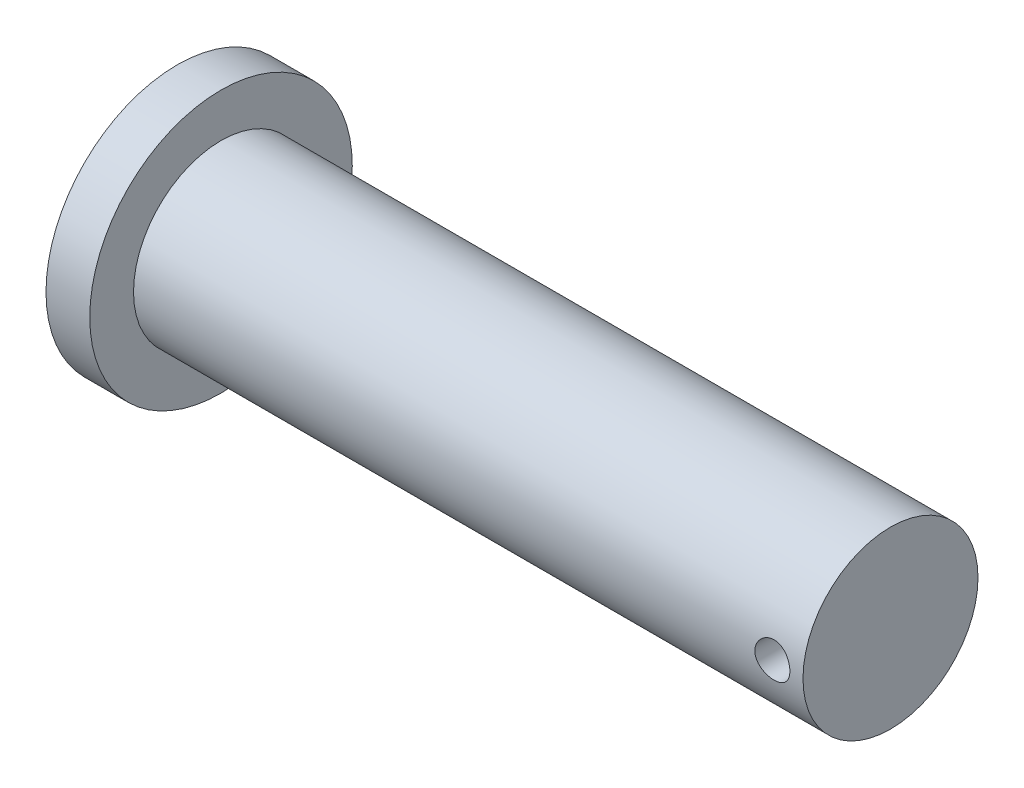
ISO-10303-21;
HEADER;
FILE_DESCRIPTION(('STEP AP214'),'2;1');
FILE_NAME('part.step','',(''),(''),'','','');
FILE_SCHEMA(('AUTOMOTIVE_DESIGN { 1 0 10303 214 1 1 1 1 }'));
ENDSEC;
DATA;
#1=APPLICATION_CONTEXT('core data for automotive mechanical design processes');
#2=APPLICATION_PROTOCOL_DEFINITION('international standard','automotive_design',2000,#1);
#3=PRODUCT_CONTEXT('',#1,'mechanical');
#4=PRODUCT('Part','Part','',(#3));
#5=PRODUCT_RELATED_PRODUCT_CATEGORY('part','',(#4));
#6=PRODUCT_DEFINITION_FORMATION('','',#4);
#7=PRODUCT_DEFINITION_CONTEXT('part definition',#1,'design');
#8=PRODUCT_DEFINITION('design','',#6,#7);
#9=PRODUCT_DEFINITION_SHAPE('','',#8);
#10=(LENGTH_UNIT() NAMED_UNIT(*) SI_UNIT(.MILLI.,.METRE.));
#11=(NAMED_UNIT(*) PLANE_ANGLE_UNIT() SI_UNIT($,.RADIAN.));
#12=(NAMED_UNIT(*) SI_UNIT($,.STERADIAN.) SOLID_ANGLE_UNIT());
#13=UNCERTAINTY_MEASURE_WITH_UNIT(LENGTH_MEASURE(1.E-05),#10,'distance_accuracy_value','');
#14=(GEOMETRIC_REPRESENTATION_CONTEXT(3) GLOBAL_UNCERTAINTY_ASSIGNED_CONTEXT((#13)) GLOBAL_UNIT_ASSIGNED_CONTEXT((#10,
#11,#12)) REPRESENTATION_CONTEXT('',''));
#15=CARTESIAN_POINT('',(0.,0.,0.));
#16=DIRECTION('',(0.,0.,1.));
#17=DIRECTION('',(1.,0.,0.));
#18=AXIS2_PLACEMENT_3D('',#15,#16,#17);
#19=CARTESIAN_POINT('',(40.75,0.,0.));
#20=DIRECTION('',(-1.,0.,0.));
#21=DIRECTION('',(0.,0.,1.));
#22=AXIS2_PLACEMENT_3D('',#19,#20,#21);
#23=CYLINDRICAL_SURFACE('',#22,4.99999999999989);
#24=CARTESIAN_POINT('',(40.,0.,4.99999999999989));
#25=CARTESIAN_POINT('',(39.9999979555017,0.0555769067926329,4.9999989758086));
#26=CARTESIAN_POINT('',(39.9953511570324,0.111179660201522,4.9990638517822));
#27=CARTESIAN_POINT('',(39.9769014998848,0.220813507689018,4.99542365623221));
#28=CARTESIAN_POINT('',(39.9630913671985,0.274843317541355,4.99271717860175));
#29=CARTESIAN_POINT('',(39.9267587263792,0.379730305263312,4.98583649278276));
#30=CARTESIAN_POINT('',(39.9042445631553,0.430590467933134,4.98166369076707));
#31=CARTESIAN_POINT('',(39.8511677524887,0.527807988864225,4.97230398035304));
#32=CARTESIAN_POINT('',(39.8206055843928,0.57416561507581,4.96711713235696));
#33=CARTESIAN_POINT('',(39.7518615057086,0.661693477314862,4.95622165329959));
#34=CARTESIAN_POINT('',(39.7135916446088,0.702793951158522,4.95050745504337));
#35=CARTESIAN_POINT('',(39.6307075836083,0.778036756608025,4.93924180452578));
#36=CARTESIAN_POINT('',(39.5860928886649,0.812178544770421,4.93369036500413));
#37=CARTESIAN_POINT('',(39.4912838069881,0.872831753347618,4.92332441812604));
#38=CARTESIAN_POINT('',(39.4410423562036,0.899270938865865,4.91851707364935));
#39=CARTESIAN_POINT('',(39.3367181809959,0.943305666580306,4.91026268058407));
#40=CARTESIAN_POINT('',(39.2826358366537,0.960902082437236,4.90681549761951));
#41=CARTESIAN_POINT('',(39.1729156360921,0.986525299884825,4.90172805252194));
#42=CARTESIAN_POINT('',(39.1173074558578,0.994674497958775,4.90006470107177));
#43=CARTESIAN_POINT('',(39.0054901786357,1.00155212772612,4.89866375060616));
#44=CARTESIAN_POINT('',(38.9492811436799,1.0002815227135,4.8989259546783));
#45=CARTESIAN_POINT('',(38.838753211979,0.988454573101817,4.90132551148174));
#46=CARTESIAN_POINT('',(38.7844185943727,0.978038540243904,4.90343452858753));
#47=CARTESIAN_POINT('',(38.678283923337,0.94843788462305,4.9092454615999));
#48=CARTESIAN_POINT('',(38.626483991081,0.929252843100679,4.91294745357768));
#49=CARTESIAN_POINT('',(38.5264847382964,0.882524783674718,4.92155618500397));
#50=CARTESIAN_POINT('',(38.4783121204308,0.854926151232114,4.92647089813694));
#51=CARTESIAN_POINT('',(38.3872291500272,0.792193574572679,4.93694618773051));
#52=CARTESIAN_POINT('',(38.3443194031489,0.757058764356829,4.94250683838355));
#53=CARTESIAN_POINT('',(38.2641705975431,0.679499934560585,4.95377021241451));
#54=CARTESIAN_POINT('',(38.2270474321409,0.636956161212446,4.95947369210894));
#55=CARTESIAN_POINT('',(38.1604461536988,0.546185024062011,4.97028848714398));
#56=CARTESIAN_POINT('',(38.1309681387064,0.49795758737939,4.97539979488963));
#57=CARTESIAN_POINT('',(38.080472490774,0.397059386878921,4.98446690160876));
#58=CARTESIAN_POINT('',(38.0594681063555,0.344381819585301,4.98842088848261));
#59=CARTESIAN_POINT('',(38.0266395259614,0.236148976448668,4.99471408987848));
#60=CARTESIAN_POINT('',(38.0148142179264,0.180594050072455,4.99705350000521));
#61=CARTESIAN_POINT('',(38.0008435462057,0.0691794056271562,4.99982671866857));
#62=CARTESIAN_POINT('',(37.9985395804597,0.0133403283255813,5.00029174652459));
#63=CARTESIAN_POINT('',(38.0032498589422,-0.0979249341927102,4.99935051930092));
#64=CARTESIAN_POINT('',(38.0102635793526,-0.15335114244379,4.99794436941435));
#65=CARTESIAN_POINT('',(38.033278373544,-0.261705659946539,4.99343832008007));
#66=CARTESIAN_POINT('',(38.0491980684979,-0.314651948339902,4.99035376404196));
#67=CARTESIAN_POINT('',(38.0894839826558,-0.417123627499666,4.98283552061022));
#68=CARTESIAN_POINT('',(38.1138508346768,-0.466648761637537,4.97840173214216));
#69=CARTESIAN_POINT('',(38.1706824906513,-0.561541173686214,4.96859911533284));
#70=CARTESIAN_POINT('',(38.2032427810389,-0.606850126752183,4.96321950437041));
#71=CARTESIAN_POINT('',(38.2754091912073,-0.691418019119202,4.95214734829872));
#72=CARTESIAN_POINT('',(38.3150160663999,-0.730676308930758,4.94645476968377));
#73=CARTESIAN_POINT('',(38.4008733518911,-0.802640590774173,4.93529303556954));
#74=CARTESIAN_POINT('',(38.4472157442213,-0.835237702448653,4.92982860233293));
#75=CARTESIAN_POINT('',(38.5448113613567,-0.892185420051203,4.91984191796183));
#76=CARTESIAN_POINT('',(38.5960643895736,-0.9165363559229,4.91531962913332));
#77=CARTESIAN_POINT('',(38.7017682461495,-0.956151841581958,4.90776740584372));
#78=CARTESIAN_POINT('',(38.7562008412103,-0.971463499791049,4.90472974872176));
#79=CARTESIAN_POINT('',(38.8669334534909,-0.992708651627194,4.90047436792014));
#80=CARTESIAN_POINT('',(38.9232332262093,-0.99864336822511,4.89925640691101));
#81=CARTESIAN_POINT('',(39.0350088645443,-1.00092091086747,4.89879149631368));
#82=CARTESIAN_POINT('',(39.090481148927,-0.997435788070895,4.8995091918929));
#83=CARTESIAN_POINT('',(39.200031649905,-0.981352304100061,4.90275573484603));
#84=CARTESIAN_POINT('',(39.2541098776948,-0.968754016129298,4.90528456767158));
#85=CARTESIAN_POINT('',(39.3592277112405,-0.934878568498954,4.91185264219148));
#86=CARTESIAN_POINT('',(39.4102743605024,-0.913622506717344,4.9158882101882));
#87=CARTESIAN_POINT('',(39.5081037207344,-0.863054644601604,4.92501714974159));
#88=CARTESIAN_POINT('',(39.5548860737251,-0.833742168774882,4.93011060998883));
#89=CARTESIAN_POINT('',(39.6437155721503,-0.767305914786414,4.94088960523215));
#90=CARTESIAN_POINT('',(39.6856687652676,-0.730057887235182,4.94658372909689));
#91=CARTESIAN_POINT('',(39.7627862055292,-0.649064369013142,4.95786081871944));
#92=CARTESIAN_POINT('',(39.7979488903173,-0.605317387153335,4.96344375863174));
#93=CARTESIAN_POINT('',(39.8608346439464,-0.512017629088247,4.97393832387961));
#94=CARTESIAN_POINT('',(39.88847600328,-0.462408884429835,4.97884231219235));
#95=CARTESIAN_POINT('',(39.9349861225966,-0.359166360940734,4.98735125084989));
#96=CARTESIAN_POINT('',(39.9538627895325,-0.305536260863127,4.99095737138605));
#97=CARTESIAN_POINT('',(39.9786519480447,-0.209821488923781,4.9957637259536));
#98=CARTESIAN_POINT('',(39.9866431937078,-0.168281664013786,4.99734303158441));
#99=CARTESIAN_POINT('',(39.9973179123584,-0.0844995252100677,4.99946154139882));
#100=CARTESIAN_POINT('',(40.0000015545098,-0.0422572337486193,5.00000077873144));
#101=CARTESIAN_POINT('',(40.,0.,4.99999999999989));
#102=B_SPLINE_CURVE_WITH_KNOTS('',3,(#24,#25,#26,#27,#28,#29,#30,#31,#32,#33,#34,#35,#36,#37,
#38,#39,#40,#41,#42,#43,#44,#45,#46,#47,#48,#49,#50,#51,#52,#53,#54,#55,#56,#57,#58,#59,#60,#61,
#62,#63,#64,#65,#66,#67,#68,#69,#70,#71,#72,#73,#74,#75,#76,#77,#78,#79,#80,#81,#82,#83,#84,#85,
#86,#87,#88,#89,#90,#91,#92,#93,#94,#95,#96,#97,#98,#99,#100,#101),.UNSPECIFIED.,.T.,.F.,(4,2,2,
2,2,2,2,2,2,2,2,2,2,2,2,2,2,2,2,2,2,2,2,2,2,2,2,2,2,2,2,2,2,2,2,2,2,2,4),(0.,0.166576130661258,
0.333284650691322,0.499833735250343,0.666372902230864,0.834932670112181,1.00350559674736,
1.17361195005923,1.34370149365197,1.51156185103587,1.67940504281224,1.84471727006277,
2.01003739253729,2.17647490203592,2.3429315474967,2.5123825249135,2.6818356753982,
2.85155274854023,3.02124925698035,3.18810735676264,3.35495607657867,3.52030453950723,
3.68566539216021,3.85305066033357,4.02045388345929,4.19040628579225,4.36035188723466,
4.52940381032723,4.69843368330413,4.86439722567699,5.03035943492607,5.19591961253109,
5.36149367581865,5.52988076239142,5.69830654532929,5.86849496675636,6.03852955517517,
6.16518775289893,6.29184191370995),.UNSPECIFIED.);
#103=CARTESIAN_POINT('',(40.,0.,4.99999999999989));
#104=VERTEX_POINT('',#103);
#105=EDGE_CURVE('E49',#104,#104,#102,.T.);
#106=ORIENTED_EDGE('',*,*,#105,.F.);
#107=EDGE_LOOP('',(#106));
#108=FACE_BOUND('',#107,.T.);
#109=CARTESIAN_POINT('',(38.,0.,-4.99999999999989));
#110=CARTESIAN_POINT('',(38.0000020444983,0.055576906792633,-4.9999989758086));
#111=CARTESIAN_POINT('',(38.0046488429676,0.111179660201522,-4.9990638517822));
#112=CARTESIAN_POINT('',(38.0230985001152,0.220813507689018,-4.99542365623221));
#113=CARTESIAN_POINT('',(38.0369086328015,0.274843317541355,-4.99271717860175));
#114=CARTESIAN_POINT('',(38.0732412736208,0.379730305263312,-4.98583649278276));
#115=CARTESIAN_POINT('',(38.0957554368447,0.430590467933134,-4.98166369076707));
#116=CARTESIAN_POINT('',(38.1488322475113,0.527807988864225,-4.97230398035304));
#117=CARTESIAN_POINT('',(38.1793944156072,0.57416561507581,-4.96711713235696));
#118=CARTESIAN_POINT('',(38.2481384942914,0.661693477314862,-4.95622165329959));
#119=CARTESIAN_POINT('',(38.2864083553912,0.702793951158522,-4.95050745504337));
#120=CARTESIAN_POINT('',(38.3692924163917,0.778036756608025,-4.93924180452578));
#121=CARTESIAN_POINT('',(38.4139071113351,0.812178544770421,-4.93369036500413));
#122=CARTESIAN_POINT('',(38.5087161930119,0.872831753347618,-4.92332441812604));
#123=CARTESIAN_POINT('',(38.5589576437964,0.899270938865865,-4.91851707364935));
#124=CARTESIAN_POINT('',(38.6632818190041,0.943305666580306,-4.91026268058407));
#125=CARTESIAN_POINT('',(38.7173641633463,0.960902082437236,-4.90681549761951));
#126=CARTESIAN_POINT('',(38.8270843639079,0.986525299884825,-4.90172805252194));
#127=CARTESIAN_POINT('',(38.8826925441422,0.994674497958775,-4.90006470107177));
#128=CARTESIAN_POINT('',(38.9945098213643,1.00155212772612,-4.89866375060616));
#129=CARTESIAN_POINT('',(39.0507188563201,1.0002815227135,-4.8989259546783));
#130=CARTESIAN_POINT('',(39.161246788021,0.988454573101817,-4.90132551148174));
#131=CARTESIAN_POINT('',(39.2155814056273,0.978038540243904,-4.90343452858753));
#132=CARTESIAN_POINT('',(39.321716076663,0.94843788462305,-4.9092454615999));
#133=CARTESIAN_POINT('',(39.373516008919,0.929252843100679,-4.91294745357768));
#134=CARTESIAN_POINT('',(39.4735152617036,0.882524783674718,-4.92155618500397));
#135=CARTESIAN_POINT('',(39.5216878795692,0.854926151232114,-4.92647089813694));
#136=CARTESIAN_POINT('',(39.6127708499728,0.792193574572679,-4.93694618773051));
#137=CARTESIAN_POINT('',(39.6556805968511,0.757058764356829,-4.94250683838355));
#138=CARTESIAN_POINT('',(39.7358294024569,0.679499934560585,-4.95377021241451));
#139=CARTESIAN_POINT('',(39.7729525678591,0.636956161212446,-4.95947369210894));
#140=CARTESIAN_POINT('',(39.8395538463012,0.546185024062011,-4.97028848714398));
#141=CARTESIAN_POINT('',(39.8690318612936,0.49795758737939,-4.97539979488963));
#142=CARTESIAN_POINT('',(39.919527509226,0.397059386878921,-4.98446690160876));
#143=CARTESIAN_POINT('',(39.9405318936445,0.344381819585301,-4.98842088848261));
#144=CARTESIAN_POINT('',(39.9733604740386,0.236148976448668,-4.99471408987848));
#145=CARTESIAN_POINT('',(39.9851857820736,0.180594050072455,-4.99705350000521));
#146=CARTESIAN_POINT('',(39.9991564537943,0.0691794056271562,-4.99982671866857));
#147=CARTESIAN_POINT('',(40.0014604195403,0.0133403283255813,-5.00029174652459));
#148=CARTESIAN_POINT('',(39.9967501410578,-0.0979249341927103,-4.99935051930092));
#149=CARTESIAN_POINT('',(39.9897364206474,-0.15335114244379,-4.99794436941435));
#150=CARTESIAN_POINT('',(39.966721626456,-0.261705659946538,-4.99343832008007));
#151=CARTESIAN_POINT('',(39.9508019315021,-0.3146519483399,-4.99035376404196));
#152=CARTESIAN_POINT('',(39.9105160173442,-0.417123627499664,-4.98283552061022));
#153=CARTESIAN_POINT('',(39.8861491653232,-0.466648761637536,-4.97840173214216));
#154=CARTESIAN_POINT('',(39.8293175093487,-0.561541173686214,-4.96859911533284));
#155=CARTESIAN_POINT('',(39.7967572189611,-0.606850126752183,-4.96321950437041));
#156=CARTESIAN_POINT('',(39.7245908087927,-0.691418019119202,-4.95214734829872));
#157=CARTESIAN_POINT('',(39.6849839336001,-0.730676308930758,-4.94645476968377));
#158=CARTESIAN_POINT('',(39.5991266481089,-0.802640590774173,-4.93529303556954));
#159=CARTESIAN_POINT('',(39.5527842557787,-0.835237702448653,-4.92982860233293));
#160=CARTESIAN_POINT('',(39.4551886386433,-0.892185420051203,-4.91984191796183));
#161=CARTESIAN_POINT('',(39.4039356104264,-0.9165363559229,-4.91531962913332));
#162=CARTESIAN_POINT('',(39.2982317538505,-0.956151841581958,-4.90776740584372));
#163=CARTESIAN_POINT('',(39.2437991587897,-0.971463499791049,-4.90472974872176));
#164=CARTESIAN_POINT('',(39.1330665465091,-0.992708651627194,-4.90047436792014));
#165=CARTESIAN_POINT('',(39.0767667737907,-0.99864336822511,-4.89925640691101));
#166=CARTESIAN_POINT('',(38.9649911354557,-1.00092091086747,-4.89879149631368));
#167=CARTESIAN_POINT('',(38.909518851073,-0.997435788070894,-4.8995091918929));
#168=CARTESIAN_POINT('',(38.799968350095,-0.98135230410006,-4.90275573484603));
#169=CARTESIAN_POINT('',(38.7458901223052,-0.968754016129297,-4.90528456767158));
#170=CARTESIAN_POINT('',(38.6407722887595,-0.934878568498954,-4.91185264219148));
#171=CARTESIAN_POINT('',(38.5897256394976,-0.913622506717344,-4.9158882101882));
#172=CARTESIAN_POINT('',(38.4918962792656,-0.863054644601604,-4.92501714974159));
#173=CARTESIAN_POINT('',(38.4451139262749,-0.833742168774882,-4.93011060998883));
#174=CARTESIAN_POINT('',(38.3562844278497,-0.767305914786414,-4.94088960523215));
#175=CARTESIAN_POINT('',(38.3143312347324,-0.730057887235182,-4.94658372909689));
#176=CARTESIAN_POINT('',(38.2372137944708,-0.649064369013142,-4.95786081871944));
#177=CARTESIAN_POINT('',(38.2020511096827,-0.605317387153335,-4.96344375863174));
#178=CARTESIAN_POINT('',(38.1391653560536,-0.512017629088247,-4.97393832387961));
#179=CARTESIAN_POINT('',(38.11152399672,-0.462408884429837,-4.97884231219235));
#180=CARTESIAN_POINT('',(38.0650138774034,-0.359166360940736,-4.98735125084989));
#181=CARTESIAN_POINT('',(38.0461372104675,-0.305536260863128,-4.99095737138605));
#182=CARTESIAN_POINT('',(38.0213480519553,-0.209821488923781,-4.9957637259536));
#183=CARTESIAN_POINT('',(38.0133568062922,-0.168281664013786,-4.99734303158441));
#184=CARTESIAN_POINT('',(38.0026820876416,-0.0844995252100677,-4.99946154139882));
#185=CARTESIAN_POINT('',(37.9999984454902,-0.0422572337486193,-5.00000077873144));
#186=CARTESIAN_POINT('',(38.,0.,-4.99999999999989));
#187=B_SPLINE_CURVE_WITH_KNOTS('',3,(#109,#110,#111,#112,#113,#114,#115,#116,#117,#118,#119,
#120,#121,#122,#123,#124,#125,#126,#127,#128,#129,#130,#131,#132,#133,#134,#135,#136,#137,#138,
#139,#140,#141,#142,#143,#144,#145,#146,#147,#148,#149,#150,#151,#152,#153,#154,#155,#156,#157,
#158,#159,#160,#161,#162,#163,#164,#165,#166,#167,#168,#169,#170,#171,#172,#173,#174,#175,#176,
#177,#178,#179,#180,#181,#182,#183,#184,#185,#186),.UNSPECIFIED.,.T.,.F.,(4,2,2,2,2,2,2,2,2,2,2,
2,2,2,2,2,2,2,2,2,2,2,2,2,2,2,2,2,2,2,2,2,2,2,2,2,2,2,4),(0.,0.166576130661258,
0.333284650691322,0.499833735250343,0.666372902230864,0.834932670112181,1.00350559674736,
1.17361195005923,1.34370149365197,1.51156185103587,1.67940504281224,1.84471727006277,
2.01003739253729,2.17647490203592,2.3429315474967,2.5123825249135,2.6818356753982,
2.85155274854023,3.02124925698035,3.18810735676264,3.35495607657867,3.52030453950723,
3.68566539216021,3.85305066033357,4.02045388345929,4.19040628579225,4.36035188723466,
4.52940381032723,4.69843368330413,4.864397225677,5.03035943492607,5.19591961253109,
5.36149367581865,5.52988076239142,5.69830654532929,5.86849496675636,6.03852955517517,
6.16518775289893,6.29184191370995),.UNSPECIFIED.);
#188=CARTESIAN_POINT('',(38.,0.,-4.99999999999989));
#189=VERTEX_POINT('',#188);
#190=EDGE_CURVE('E55',#189,#189,#187,.T.);
#191=ORIENTED_EDGE('',*,*,#190,.F.);
#192=EDGE_LOOP('',(#191));
#193=FACE_BOUND('',#192,.T.);
#194=CARTESIAN_POINT('',(40.75,0.,0.));
#195=DIRECTION('',(1.,0.,0.));
#196=DIRECTION('',(0.,0.,-1.));
#197=AXIS2_PLACEMENT_3D('',#194,#195,#196);
#198=CIRCLE('',#197,4.99999999999989);
#199=CARTESIAN_POINT('',(40.75,0.,-4.99999999999989));
#200=VERTEX_POINT('',#199);
#201=EDGE_CURVE('E44',#200,#200,#198,.T.);
#202=ORIENTED_EDGE('',*,*,#201,.F.);
#203=EDGE_LOOP('',(#202));
#204=FACE_BOUND('',#203,.T.);
#205=CARTESIAN_POINT('',(2.5,0.,0.));
#206=DIRECTION('',(-1.,0.,0.));
#207=DIRECTION('',(0.,0.,1.));
#208=AXIS2_PLACEMENT_3D('',#205,#206,#207);
#209=CIRCLE('',#208,4.99999999999989);
#210=CARTESIAN_POINT('',(2.5,0.,4.99999999999989));
#211=VERTEX_POINT('',#210);
#212=EDGE_CURVE('E10',#211,#211,#209,.T.);
#213=ORIENTED_EDGE('',*,*,#212,.F.);
#214=EDGE_LOOP('',(#213));
#215=FACE_BOUND('',#214,.T.);
#216=ADVANCED_FACE('F36',(#108,#193,#204,#215),#23,.T.);
#217=CARTESIAN_POINT('',(40.75,0.,0.));
#218=DIRECTION('',(1.,0.,0.));
#219=DIRECTION('',(0.,0.,-1.));
#220=AXIS2_PLACEMENT_3D('',#217,#218,#219);
#221=PLANE('',#220);
#222=ORIENTED_EDGE('',*,*,#201,.T.);
#223=EDGE_LOOP('',(#222));
#224=FACE_BOUND('',#223,.T.);
#225=ADVANCED_FACE('F76',(#224),#221,.T.);
#226=CARTESIAN_POINT('',(39.,0.,12.5));
#227=DIRECTION('',(0.,0.,-1.));
#228=DIRECTION('',(-1.,0.,0.));
#229=AXIS2_PLACEMENT_3D('',#226,#227,#228);
#230=CYLINDRICAL_SURFACE('',#229,0.999999999999998);
#231=ORIENTED_EDGE('',*,*,#190,.T.);
#232=EDGE_LOOP('',(#231));
#233=FACE_BOUND('',#232,.T.);
#234=ORIENTED_EDGE('',*,*,#105,.T.);
#235=EDGE_LOOP('',(#234));
#236=FACE_BOUND('',#235,.T.);
#237=ADVANCED_FACE('F70',(#233,#236),#230,.F.);
#238=CARTESIAN_POINT('',(2.5,0.,0.));
#239=DIRECTION('',(-1.,0.,0.));
#240=DIRECTION('',(0.,0.,1.));
#241=AXIS2_PLACEMENT_3D('',#238,#239,#240);
#242=CYLINDRICAL_SURFACE('',#241,7.5);
#243=CARTESIAN_POINT('',(2.5,0.,0.));
#244=DIRECTION('',(-1.,0.,0.));
#245=DIRECTION('',(0.,0.,1.));
#246=AXIS2_PLACEMENT_3D('',#243,#244,#245);
#247=CIRCLE('',#246,7.5);
#248=CARTESIAN_POINT('',(2.5,0.,7.5));
#249=VERTEX_POINT('',#248);
#250=EDGE_CURVE('E66',#249,#249,#247,.T.);
#251=ORIENTED_EDGE('',*,*,#250,.T.);
#252=EDGE_LOOP('',(#251));
#253=FACE_BOUND('',#252,.T.);
#254=CARTESIAN_POINT('',(0.,0.,0.));
#255=DIRECTION('',(-1.,0.,0.));
#256=DIRECTION('',(0.,0.,1.));
#257=AXIS2_PLACEMENT_3D('',#254,#255,#256);
#258=CIRCLE('',#257,7.5);
#259=CARTESIAN_POINT('',(0.,0.,7.5));
#260=VERTEX_POINT('',#259);
#261=EDGE_CURVE('E58',#260,#260,#258,.T.);
#262=ORIENTED_EDGE('',*,*,#261,.F.);
#263=EDGE_LOOP('',(#262));
#264=FACE_BOUND('',#263,.T.);
#265=ADVANCED_FACE('F75',(#253,#264),#242,.T.);
#266=CARTESIAN_POINT('',(2.5,0.,0.));
#267=DIRECTION('',(-1.,0.,0.));
#268=DIRECTION('',(0.,0.,1.));
#269=AXIS2_PLACEMENT_3D('',#266,#267,#268);
#270=PLANE('',#269);
#271=ORIENTED_EDGE('',*,*,#212,.T.);
#272=EDGE_LOOP('',(#271));
#273=FACE_BOUND('',#272,.T.);
#274=ORIENTED_EDGE('',*,*,#250,.F.);
#275=EDGE_LOOP('',(#274));
#276=FACE_BOUND('',#275,.T.);
#277=ADVANCED_FACE('F83',(#273,#276),#270,.F.);
#278=CARTESIAN_POINT('',(0.,0.,0.));
#279=DIRECTION('',(1.,0.,0.));
#280=DIRECTION('',(0.,0.,-1.));
#281=AXIS2_PLACEMENT_3D('',#278,#279,#280);
#282=PLANE('',#281);
#283=ORIENTED_EDGE('',*,*,#261,.T.);
#284=EDGE_LOOP('',(#283));
#285=FACE_BOUND('',#284,.T.);
#286=ADVANCED_FACE('F81',(#285),#282,.F.);
#287=CLOSED_SHELL('',(#216,#225,#237,#265,#277,#286));
#288=MANIFOLD_SOLID_BREP('B2',#287);
#289=ADVANCED_BREP_SHAPE_REPRESENTATION('',(#18,#288),#14);
#290=SHAPE_DEFINITION_REPRESENTATION(#9,#289);
ENDSEC;
END-ISO-10303-21;
